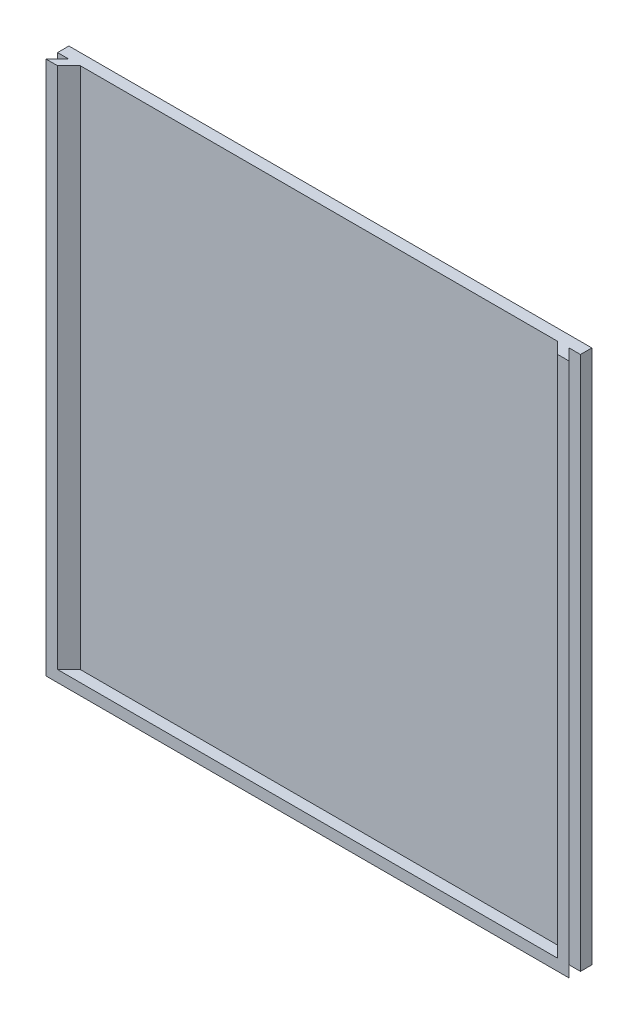
ISO-10303-21;
HEADER;
FILE_DESCRIPTION(('STEP AP214'),'2;1');
FILE_NAME('part.step','',(''),(''),'','','');
FILE_SCHEMA(('AUTOMOTIVE_DESIGN { 1 0 10303 214 1 1 1 1 }'));
ENDSEC;
DATA;
#1=APPLICATION_CONTEXT('core data for automotive mechanical design processes');
#2=APPLICATION_PROTOCOL_DEFINITION('international standard','automotive_design',2000,#1);
#3=PRODUCT_CONTEXT('',#1,'mechanical');
#4=PRODUCT('Part','Part','',(#3));
#5=PRODUCT_RELATED_PRODUCT_CATEGORY('part','',(#4));
#6=PRODUCT_DEFINITION_FORMATION('','',#4);
#7=PRODUCT_DEFINITION_CONTEXT('part definition',#1,'design');
#8=PRODUCT_DEFINITION('design','',#6,#7);
#9=PRODUCT_DEFINITION_SHAPE('','',#8);
#10=(LENGTH_UNIT() NAMED_UNIT(*) SI_UNIT(.MILLI.,.METRE.));
#11=(NAMED_UNIT(*) PLANE_ANGLE_UNIT() SI_UNIT($,.RADIAN.));
#12=(NAMED_UNIT(*) SI_UNIT($,.STERADIAN.) SOLID_ANGLE_UNIT());
#13=UNCERTAINTY_MEASURE_WITH_UNIT(LENGTH_MEASURE(1.E-05),#10,'distance_accuracy_value','');
#14=(GEOMETRIC_REPRESENTATION_CONTEXT(3) GLOBAL_UNCERTAINTY_ASSIGNED_CONTEXT((#13)) GLOBAL_UNIT_ASSIGNED_CONTEXT((#10,
#11,#12)) REPRESENTATION_CONTEXT('',''));
#15=CARTESIAN_POINT('',(0.,0.,0.));
#16=DIRECTION('',(0.,0.,1.));
#17=DIRECTION('',(1.,0.,0.));
#18=AXIS2_PLACEMENT_3D('',#15,#16,#17);
#19=CARTESIAN_POINT('',(-11.0500000000001,47.,-11.0500000000001));
#20=DIRECTION('',(0.707106781186547,0.,0.707106781186547));
#21=DIRECTION('',(0.707106781186548,0.,-0.707106781186548));
#22=AXIS2_PLACEMENT_3D('',#19,#20,#21);
#23=PLANE('',#22);
#24=DIRECTION('',(0.,-1.,0.));
#25=VECTOR('',#24,1.);
#26=CARTESIAN_POINT('',(-22.0000000000001,47.,-0.100000000000053));
#27=LINE('',#26,#25);
#28=CARTESIAN_POINT('',(-22.0000000000001,47.,-0.100000000000053));
#29=VERTEX_POINT('',#28);
#30=CARTESIAN_POINT('',(-22.0000000000001,1.,-0.100000000000053));
#31=VERTEX_POINT('',#30);
#32=EDGE_CURVE('E185',#29,#31,#27,.T.);
#33=ORIENTED_EDGE('',*,*,#32,.T.);
#34=DIRECTION('',(-0.707106781186548,0.,0.707106781186548));
#35=VECTOR('',#34,1.);
#36=CARTESIAN_POINT('',(-11.0500000000001,1.,-11.0500000000001));
#37=LINE('',#36,#35);
#38=CARTESIAN_POINT('',(-21.0000000000001,1.,-1.10000000000004));
#39=VERTEX_POINT('',#38);
#40=EDGE_CURVE('E246',#39,#31,#37,.T.);
#41=ORIENTED_EDGE('',*,*,#40,.F.);
#42=DIRECTION('',(0.,-1.,0.));
#43=VECTOR('',#42,1.);
#44=CARTESIAN_POINT('',(-21.0000000000001,47.,-1.10000000000004));
#45=LINE('',#44,#43);
#46=CARTESIAN_POINT('',(-21.0000000000001,47.,-1.10000000000004));
#47=VERTEX_POINT('',#46);
#48=EDGE_CURVE('E182',#47,#39,#45,.T.);
#49=ORIENTED_EDGE('',*,*,#48,.F.);
#50=DIRECTION('',(-0.707106781186548,0.,0.707106781186548));
#51=VECTOR('',#50,1.);
#52=CARTESIAN_POINT('',(-11.0500000000001,47.,-11.0500000000001));
#53=LINE('',#52,#51);
#54=EDGE_CURVE('E218',#47,#29,#53,.T.);
#55=ORIENTED_EDGE('',*,*,#54,.T.);
#56=EDGE_LOOP('',(#33,#41,#49,#55));
#57=FACE_BOUND('',#56,.T.);
#58=ADVANCED_FACE('F43',(#57),#23,.T.);
#59=CARTESIAN_POINT('',(0.,47.,-1.10000000000005));
#60=DIRECTION('',(0.,0.,1.));
#61=DIRECTION('',(1.,0.,0.));
#62=AXIS2_PLACEMENT_3D('',#59,#60,#61);
#63=PLANE('',#62);
#64=ORIENTED_EDGE('',*,*,#48,.T.);
#65=DIRECTION('',(-1.,0.,0.));
#66=VECTOR('',#65,1.);
#67=CARTESIAN_POINT('',(0.,1.,-1.10000000000005));
#68=LINE('',#67,#66);
#69=CARTESIAN_POINT('',(20.9999999999999,1.,-1.10000000000005));
#70=VERTEX_POINT('',#69);
#71=EDGE_CURVE('E155',#70,#39,#68,.T.);
#72=ORIENTED_EDGE('',*,*,#71,.F.);
#73=DIRECTION('',(0.,-1.,0.));
#74=VECTOR('',#73,1.);
#75=CARTESIAN_POINT('',(20.9999999999999,47.,-1.10000000000005));
#76=LINE('',#75,#74);
#77=CARTESIAN_POINT('',(20.9999999999999,47.,-1.10000000000005));
#78=VERTEX_POINT('',#77);
#79=EDGE_CURVE('E179',#78,#70,#76,.T.);
#80=ORIENTED_EDGE('',*,*,#79,.F.);
#81=DIRECTION('',(-1.,0.,0.));
#82=VECTOR('',#81,1.);
#83=CARTESIAN_POINT('',(0.,47.,-1.10000000000005));
#84=LINE('',#83,#82);
#85=EDGE_CURVE('E221',#78,#47,#84,.T.);
#86=ORIENTED_EDGE('',*,*,#85,.T.);
#87=EDGE_LOOP('',(#64,#72,#80,#86));
#88=FACE_BOUND('',#87,.T.);
#89=ADVANCED_FACE('F259',(#88),#63,.T.);
#90=CARTESIAN_POINT('',(11.0500000000002,47.,-11.05));
#91=DIRECTION('',(0.707106781186556,0.,-0.707106781186539));
#92=DIRECTION('',(-0.707106781186539,0.,-0.707106781186556));
#93=AXIS2_PLACEMENT_3D('',#90,#91,#92);
#94=PLANE('',#93);
#95=DIRECTION('',(-0.707106781186539,0.,-0.707106781186556));
#96=VECTOR('',#95,1.);
#97=CARTESIAN_POINT('',(11.0500000000002,1.,-11.05));
#98=LINE('',#97,#96);
#99=CARTESIAN_POINT('',(21.9999999999999,1.,-0.100000000000058));
#100=VERTEX_POINT('',#99);
#101=EDGE_CURVE('E241',#100,#70,#98,.T.);
#102=ORIENTED_EDGE('',*,*,#101,.F.);
#103=DIRECTION('',(0.,-1.,0.));
#104=VECTOR('',#103,1.);
#105=CARTESIAN_POINT('',(21.9999999999999,47.,-0.100000000000056));
#106=LINE('',#105,#104);
#107=CARTESIAN_POINT('',(21.9999999999999,47.,-0.100000000000056));
#108=VERTEX_POINT('',#107);
#109=EDGE_CURVE('E176',#108,#100,#106,.T.);
#110=ORIENTED_EDGE('',*,*,#109,.F.);
#111=DIRECTION('',(0.707106781186539,0.,0.707106781186556));
#112=VECTOR('',#111,1.);
#113=CARTESIAN_POINT('',(11.0500000000002,47.,-11.05));
#114=LINE('',#113,#112);
#115=EDGE_CURVE('E228',#78,#108,#114,.T.);
#116=ORIENTED_EDGE('',*,*,#115,.F.);
#117=ORIENTED_EDGE('',*,*,#79,.T.);
#118=EDGE_LOOP('',(#102,#110,#116,#117));
#119=FACE_BOUND('',#118,.T.);
#120=ADVANCED_FACE('F238',(#119),#94,.F.);
#121=CARTESIAN_POINT('',(2.98719382563671E-13,47.,-2.10000000000327));
#122=DIRECTION('',(1.42247325030098E-13,0.,-1.));
#123=DIRECTION('',(-1.,0.,-1.42247325030098E-13));
#124=AXIS2_PLACEMENT_3D('',#121,#122,#123);
#125=PLANE('',#124);
#126=DIRECTION('',(1.,0.,1.42247325030098E-13));
#127=VECTOR('',#126,1.);
#128=CARTESIAN_POINT('',(2.98719382563671E-13,0.,-2.10000000000327));
#129=LINE('',#128,#127);
#130=CARTESIAN_POINT('',(-23.0000000000001,0.,-2.10000000000655));
#131=VERTEX_POINT('',#130);
#132=CARTESIAN_POINT('',(23.0000000000001,0.,-2.1));
#133=VERTEX_POINT('',#132);
#134=EDGE_CURVE('E152',#131,#133,#129,.T.);
#135=ORIENTED_EDGE('',*,*,#134,.F.);
#136=DIRECTION('',(0.,-1.,0.));
#137=VECTOR('',#136,1.);
#138=CARTESIAN_POINT('',(-23.0000000000001,47.,-2.10000000000655));
#139=LINE('',#138,#137);
#140=CARTESIAN_POINT('',(-23.0000000000001,47.,-2.10000000000655));
#141=VERTEX_POINT('',#140);
#142=EDGE_CURVE('E11',#141,#131,#139,.T.);
#143=ORIENTED_EDGE('',*,*,#142,.F.);
#144=DIRECTION('',(1.,0.,1.42247325030098E-13));
#145=VECTOR('',#144,1.);
#146=CARTESIAN_POINT('',(2.98719382563671E-13,47.,-2.10000000000327));
#147=LINE('',#146,#145);
#148=CARTESIAN_POINT('',(23.0000000000001,47.,-2.1));
#149=VERTEX_POINT('',#148);
#150=EDGE_CURVE('E172',#141,#149,#147,.T.);
#151=ORIENTED_EDGE('',*,*,#150,.T.);
#152=DIRECTION('',(0.,-1.,0.));
#153=VECTOR('',#152,1.);
#154=CARTESIAN_POINT('',(23.0000000000001,47.,-2.1));
#155=LINE('',#154,#153);
#156=EDGE_CURVE('E60',#149,#133,#155,.T.);
#157=ORIENTED_EDGE('',*,*,#156,.T.);
#158=EDGE_LOOP('',(#135,#143,#151,#157));
#159=FACE_BOUND('',#158,.T.);
#160=ADVANCED_FACE('F45',(#159),#125,.T.);
#161=CARTESIAN_POINT('',(-23.0000000000001,47.,0.));
#162=DIRECTION('',(1.,0.,0.));
#163=DIRECTION('',(0.,0.,-1.));
#164=AXIS2_PLACEMENT_3D('',#161,#162,#163);
#165=PLANE('',#164);
#166=DIRECTION('',(0.,0.,1.));
#167=VECTOR('',#166,1.);
#168=CARTESIAN_POINT('',(-23.0000000000001,0.,0.));
#169=LINE('',#168,#167);
#170=CARTESIAN_POINT('',(-23.0000000000001,0.,-1.10000000000004));
#171=VERTEX_POINT('',#170);
#172=EDGE_CURVE('E154',#131,#171,#169,.T.);
#173=ORIENTED_EDGE('',*,*,#172,.T.);
#174=DIRECTION('',(0.,-1.,0.));
#175=VECTOR('',#174,1.);
#176=CARTESIAN_POINT('',(-23.0000000000001,47.,-1.10000000000004));
#177=LINE('',#176,#175);
#178=CARTESIAN_POINT('',(-23.0000000000001,47.,-1.10000000000004));
#179=VERTEX_POINT('',#178);
#180=EDGE_CURVE('E52',#179,#171,#177,.T.);
#181=ORIENTED_EDGE('',*,*,#180,.F.);
#182=DIRECTION('',(0.,0.,1.));
#183=VECTOR('',#182,1.);
#184=CARTESIAN_POINT('',(-23.0000000000001,47.,0.));
#185=LINE('',#184,#183);
#186=EDGE_CURVE('E253',#141,#179,#185,.T.);
#187=ORIENTED_EDGE('',*,*,#186,.F.);
#188=ORIENTED_EDGE('',*,*,#142,.T.);
#189=EDGE_LOOP('',(#173,#181,#187,#188));
#190=FACE_BOUND('',#189,.T.);
#191=ADVANCED_FACE('F201',(#190),#165,.F.);
#192=CARTESIAN_POINT('',(0.,47.,-1.10000000000004));
#193=DIRECTION('',(0.,0.,1.));
#194=DIRECTION('',(1.,0.,0.));
#195=AXIS2_PLACEMENT_3D('',#192,#193,#194);
#196=PLANE('',#195);
#197=DIRECTION('',(-1.,0.,0.));
#198=VECTOR('',#197,1.);
#199=CARTESIAN_POINT('',(0.,0.,-1.10000000000004));
#200=LINE('',#199,#198);
#201=CARTESIAN_POINT('',(-22.0000000000001,0.,-1.10000000000004));
#202=VERTEX_POINT('',#201);
#203=EDGE_CURVE('E158',#202,#171,#200,.T.);
#204=ORIENTED_EDGE('',*,*,#203,.F.);
#205=DIRECTION('',(0.,-1.,0.));
#206=VECTOR('',#205,1.);
#207=CARTESIAN_POINT('',(-22.0000000000001,47.,-1.10000000000004));
#208=LINE('',#207,#206);
#209=CARTESIAN_POINT('',(-22.0000000000001,47.,-1.10000000000004));
#210=VERTEX_POINT('',#209);
#211=EDGE_CURVE('E191',#210,#202,#208,.T.);
#212=ORIENTED_EDGE('',*,*,#211,.F.);
#213=DIRECTION('',(-1.,0.,0.));
#214=VECTOR('',#213,1.);
#215=CARTESIAN_POINT('',(0.,47.,-1.10000000000004));
#216=LINE('',#215,#214);
#217=EDGE_CURVE('E198',#210,#179,#216,.T.);
#218=ORIENTED_EDGE('',*,*,#217,.T.);
#219=ORIENTED_EDGE('',*,*,#180,.T.);
#220=EDGE_LOOP('',(#204,#212,#218,#219));
#221=FACE_BOUND('',#220,.T.);
#222=ADVANCED_FACE('F196',(#221),#196,.T.);
#223=CARTESIAN_POINT('',(-11.55,47.,-11.5500000000001));
#224=DIRECTION('',(0.707106781186545,0.,0.70710678118655));
#225=DIRECTION('',(0.70710678118655,0.,-0.707106781186545));
#226=AXIS2_PLACEMENT_3D('',#223,#224,#225);
#227=PLANE('',#226);
#228=DIRECTION('',(-0.70710678118655,0.,0.707106781186545));
#229=VECTOR('',#228,1.);
#230=CARTESIAN_POINT('',(-11.55,0.,-11.5500000000001));
#231=LINE('',#230,#229);
#232=CARTESIAN_POINT('',(-23.0000000000001,0.,-0.100000000000052));
#233=VERTEX_POINT('',#232);
#234=EDGE_CURVE('E161',#202,#233,#231,.T.);
#235=ORIENTED_EDGE('',*,*,#234,.T.);
#236=DIRECTION('',(0.,-1.,0.));
#237=VECTOR('',#236,1.);
#238=CARTESIAN_POINT('',(-23.0000000000001,47.,-0.100000000000052));
#239=LINE('',#238,#237);
#240=CARTESIAN_POINT('',(-23.0000000000001,47.,-0.100000000000052));
#241=VERTEX_POINT('',#240);
#242=EDGE_CURVE('E188',#241,#233,#239,.T.);
#243=ORIENTED_EDGE('',*,*,#242,.F.);
#244=DIRECTION('',(-0.70710678118655,0.,0.707106781186545));
#245=VECTOR('',#244,1.);
#246=CARTESIAN_POINT('',(-11.55,47.,-11.5500000000001));
#247=LINE('',#246,#245);
#248=EDGE_CURVE('E219',#210,#241,#247,.T.);
#249=ORIENTED_EDGE('',*,*,#248,.F.);
#250=ORIENTED_EDGE('',*,*,#211,.T.);
#251=EDGE_LOOP('',(#235,#243,#249,#250));
#252=FACE_BOUND('',#251,.T.);
#253=ADVANCED_FACE('F208',(#252),#227,.F.);
#254=CARTESIAN_POINT('',(0.,47.,-0.0999999999974918));
#255=DIRECTION('',(1.16565286069361E-13,0.,1.));
#256=DIRECTION('',(1.,0.,-1.16565286069361E-13));
#257=AXIS2_PLACEMENT_3D('',#254,#255,#256);
#258=PLANE('',#257);
#259=DIRECTION('',(-1.,0.,1.16565286069361E-13));
#260=VECTOR('',#259,1.);
#261=CARTESIAN_POINT('',(0.,0.,-0.0999999999974918));
#262=LINE('',#261,#260);
#263=CARTESIAN_POINT('',(22.9999999999998,0.,-0.100000000000173));
#264=VERTEX_POINT('',#263);
#265=EDGE_CURVE('E164',#264,#233,#262,.T.);
#266=ORIENTED_EDGE('',*,*,#265,.F.);
#267=DIRECTION('',(0.,-1.,0.));
#268=VECTOR('',#267,1.);
#269=CARTESIAN_POINT('',(22.9999999999998,47.,-0.100000000000173));
#270=LINE('',#269,#268);
#271=CARTESIAN_POINT('',(22.9999999999998,47.,-0.100000000000173));
#272=VERTEX_POINT('',#271);
#273=EDGE_CURVE('E134',#272,#264,#270,.T.);
#274=ORIENTED_EDGE('',*,*,#273,.F.);
#275=DIRECTION('',(-1.,0.,1.16565286069361E-13));
#276=VECTOR('',#275,1.);
#277=CARTESIAN_POINT('',(0.,47.,-0.0999999999974918));
#278=LINE('',#277,#276);
#279=EDGE_CURVE('E144',#272,#108,#278,.T.);
#280=ORIENTED_EDGE('',*,*,#279,.T.);
#281=ORIENTED_EDGE('',*,*,#109,.T.);
#282=DIRECTION('',(-1.,0.,0.));
#283=VECTOR('',#282,1.);
#284=CARTESIAN_POINT('',(0.,1.,-0.100000000000054));
#285=LINE('',#284,#283);
#286=EDGE_CURVE('E233',#100,#31,#285,.T.);
#287=ORIENTED_EDGE('',*,*,#286,.T.);
#288=ORIENTED_EDGE('',*,*,#32,.F.);
#289=DIRECTION('',(1.,0.,0.));
#290=VECTOR('',#289,1.);
#291=CARTESIAN_POINT('',(0.,47.,-0.10000000000006));
#292=LINE('',#291,#290);
#293=EDGE_CURVE('E214',#241,#29,#292,.T.);
#294=ORIENTED_EDGE('',*,*,#293,.F.);
#295=ORIENTED_EDGE('',*,*,#242,.T.);
#296=EDGE_LOOP('',(#266,#274,#280,#281,#287,#288,#294,#295));
#297=FACE_BOUND('',#296,.T.);
#298=ADVANCED_FACE('F212',(#297),#258,.T.);
#299=CARTESIAN_POINT('',(11.5500000000001,47.,-11.55));
#300=DIRECTION('',(0.70710678118655,0.,-0.707106781186545));
#301=DIRECTION('',(-0.707106781186545,0.,-0.70710678118655));
#302=AXIS2_PLACEMENT_3D('',#299,#300,#301);
#303=PLANE('',#302);
#304=DIRECTION('',(0.707106781186545,0.,0.70710678118655));
#305=VECTOR('',#304,1.);
#306=CARTESIAN_POINT('',(11.5500000000001,0.,-11.55));
#307=LINE('',#306,#305);
#308=CARTESIAN_POINT('',(21.9999999999999,0.,-1.10000000000004));
#309=VERTEX_POINT('',#308);
#310=EDGE_CURVE('E130',#309,#264,#307,.T.);
#311=ORIENTED_EDGE('',*,*,#310,.F.);
#312=DIRECTION('',(0.,-1.,0.));
#313=VECTOR('',#312,1.);
#314=CARTESIAN_POINT('',(21.9999999999999,47.,-1.10000000000004));
#315=LINE('',#314,#313);
#316=CARTESIAN_POINT('',(21.9999999999999,47.,-1.10000000000004));
#317=VERTEX_POINT('',#316);
#318=EDGE_CURVE('E125',#317,#309,#315,.T.);
#319=ORIENTED_EDGE('',*,*,#318,.F.);
#320=DIRECTION('',(0.707106781186545,0.,0.70710678118655));
#321=VECTOR('',#320,1.);
#322=CARTESIAN_POINT('',(11.5500000000001,47.,-11.55));
#323=LINE('',#322,#321);
#324=EDGE_CURVE('E128',#317,#272,#323,.T.);
#325=ORIENTED_EDGE('',*,*,#324,.T.);
#326=ORIENTED_EDGE('',*,*,#273,.T.);
#327=EDGE_LOOP('',(#311,#319,#325,#326));
#328=FACE_BOUND('',#327,.T.);
#329=ADVANCED_FACE('F127',(#328),#303,.T.);
#330=CARTESIAN_POINT('',(0.,47.,-1.09999999999989));
#331=DIRECTION('',(0.,0.,1.));
#332=DIRECTION('',(1.,0.,0.));
#333=AXIS2_PLACEMENT_3D('',#330,#331,#332);
#334=PLANE('',#333);
#335=DIRECTION('',(-1.,0.,0.));
#336=VECTOR('',#335,1.);
#337=CARTESIAN_POINT('',(0.,0.,-1.09999999999989));
#338=LINE('',#337,#336);
#339=CARTESIAN_POINT('',(22.9999999999999,0.,-1.10000000000005));
#340=VERTEX_POINT('',#339);
#341=EDGE_CURVE('E167',#340,#309,#338,.T.);
#342=ORIENTED_EDGE('',*,*,#341,.F.);
#343=DIRECTION('',(0.,-1.,0.));
#344=VECTOR('',#343,1.);
#345=CARTESIAN_POINT('',(22.9999999999999,47.,-1.10000000000005));
#346=LINE('',#345,#344);
#347=CARTESIAN_POINT('',(22.9999999999999,47.,-1.10000000000005));
#348=VERTEX_POINT('',#347);
#349=EDGE_CURVE('E86',#348,#340,#346,.T.);
#350=ORIENTED_EDGE('',*,*,#349,.F.);
#351=DIRECTION('',(-1.,0.,0.));
#352=VECTOR('',#351,1.);
#353=CARTESIAN_POINT('',(0.,47.,-1.09999999999989));
#354=LINE('',#353,#352);
#355=EDGE_CURVE('E142',#348,#317,#354,.T.);
#356=ORIENTED_EDGE('',*,*,#355,.T.);
#357=ORIENTED_EDGE('',*,*,#318,.T.);
#358=EDGE_LOOP('',(#342,#350,#356,#357));
#359=FACE_BOUND('',#358,.T.);
#360=ADVANCED_FACE('F146',(#359),#334,.T.);
#361=CARTESIAN_POINT('',(22.9999999999998,47.,3.3514857555873E-12));
#362=DIRECTION('',(1.,0.,1.45716771982058E-13));
#363=DIRECTION('',(1.45716771982058E-13,0.,-1.));
#364=AXIS2_PLACEMENT_3D('',#361,#362,#363);
#365=PLANE('',#364);
#366=DIRECTION('',(-1.45716771982058E-13,0.,1.));
#367=VECTOR('',#366,1.);
#368=CARTESIAN_POINT('',(22.9999999999998,0.,3.3514857555873E-12));
#369=LINE('',#368,#367);
#370=EDGE_CURVE('E169',#133,#340,#369,.T.);
#371=ORIENTED_EDGE('',*,*,#370,.F.);
#372=ORIENTED_EDGE('',*,*,#156,.F.);
#373=DIRECTION('',(-1.45716771982058E-13,0.,1.));
#374=VECTOR('',#373,1.);
#375=CARTESIAN_POINT('',(22.9999999999998,47.,3.3514857555873E-12));
#376=LINE('',#375,#374);
#377=EDGE_CURVE('E147',#149,#348,#376,.T.);
#378=ORIENTED_EDGE('',*,*,#377,.T.);
#379=ORIENTED_EDGE('',*,*,#349,.T.);
#380=EDGE_LOOP('',(#371,#372,#378,#379));
#381=FACE_BOUND('',#380,.T.);
#382=ADVANCED_FACE('F298',(#381),#365,.T.);
#383=CARTESIAN_POINT('',(0.,47.,0.));
#384=DIRECTION('',(0.,1.,0.));
#385=DIRECTION('',(0.,0.,1.));
#386=AXIS2_PLACEMENT_3D('',#383,#384,#385);
#387=PLANE('',#386);
#388=ORIENTED_EDGE('',*,*,#150,.F.);
#389=ORIENTED_EDGE('',*,*,#186,.T.);
#390=ORIENTED_EDGE('',*,*,#217,.F.);
#391=ORIENTED_EDGE('',*,*,#248,.T.);
#392=ORIENTED_EDGE('',*,*,#293,.T.);
#393=ORIENTED_EDGE('',*,*,#54,.F.);
#394=ORIENTED_EDGE('',*,*,#85,.F.);
#395=ORIENTED_EDGE('',*,*,#115,.T.);
#396=ORIENTED_EDGE('',*,*,#279,.F.);
#397=ORIENTED_EDGE('',*,*,#324,.F.);
#398=ORIENTED_EDGE('',*,*,#355,.F.);
#399=ORIENTED_EDGE('',*,*,#377,.F.);
#400=EDGE_LOOP('',(#388,#389,#390,#391,#392,#393,#394,#395,#396,#397,#398,#399));
#401=FACE_BOUND('',#400,.T.);
#402=ADVANCED_FACE('F140',(#401),#387,.T.);
#403=CARTESIAN_POINT('',(0.,0.,0.));
#404=DIRECTION('',(0.,1.,0.));
#405=DIRECTION('',(0.,0.,1.));
#406=AXIS2_PLACEMENT_3D('',#403,#404,#405);
#407=PLANE('',#406);
#408=ORIENTED_EDGE('',*,*,#265,.T.);
#409=ORIENTED_EDGE('',*,*,#234,.F.);
#410=ORIENTED_EDGE('',*,*,#203,.T.);
#411=ORIENTED_EDGE('',*,*,#172,.F.);
#412=ORIENTED_EDGE('',*,*,#134,.T.);
#413=ORIENTED_EDGE('',*,*,#370,.T.);
#414=ORIENTED_EDGE('',*,*,#341,.T.);
#415=ORIENTED_EDGE('',*,*,#310,.T.);
#416=EDGE_LOOP('',(#408,#409,#410,#411,#412,#413,#414,#415));
#417=FACE_BOUND('',#416,.T.);
#418=ADVANCED_FACE('F204',(#417),#407,.F.);
#419=CARTESIAN_POINT('',(0.,1.,0.));
#420=DIRECTION('',(0.,-1.,0.));
#421=DIRECTION('',(0.,0.,-1.));
#422=AXIS2_PLACEMENT_3D('',#419,#420,#421);
#423=PLANE('',#422);
#424=ORIENTED_EDGE('',*,*,#101,.T.);
#425=ORIENTED_EDGE('',*,*,#71,.T.);
#426=ORIENTED_EDGE('',*,*,#40,.T.);
#427=ORIENTED_EDGE('',*,*,#286,.F.);
#428=EDGE_LOOP('',(#424,#425,#426,#427));
#429=FACE_BOUND('',#428,.T.);
#430=ADVANCED_FACE('F323',(#429),#423,.F.);
#431=CLOSED_SHELL('',(#58,#89,#120,#160,#191,#222,#253,#298,#329,#360,#382,#402,#418,#430));
#432=MANIFOLD_SOLID_BREP('B2',#431);
#433=ADVANCED_BREP_SHAPE_REPRESENTATION('',(#18,#432),#14);
#434=SHAPE_DEFINITION_REPRESENTATION(#9,#433);
ENDSEC;
END-ISO-10303-21;
